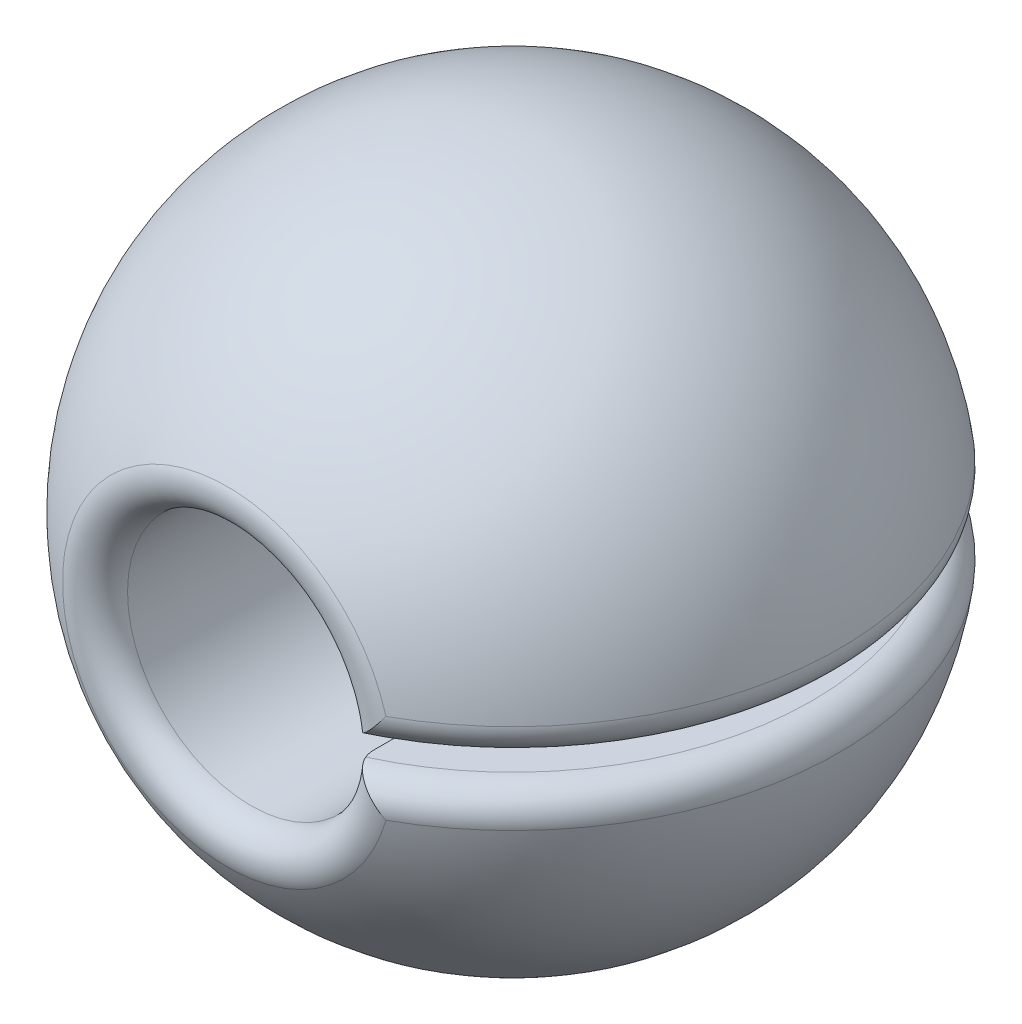
ISO-10303-21;
HEADER;
FILE_DESCRIPTION(('STEP AP214'),'2;1');
FILE_NAME('part.step','',(''),(''),'','','');
FILE_SCHEMA(('AUTOMOTIVE_DESIGN { 1 0 10303 214 1 1 1 1 }'));
ENDSEC;
DATA;
#1=APPLICATION_CONTEXT('core data for automotive mechanical design processes');
#2=APPLICATION_PROTOCOL_DEFINITION('international standard','automotive_design',2000,#1);
#3=PRODUCT_CONTEXT('',#1,'mechanical');
#4=PRODUCT('Part','Part','',(#3));
#5=PRODUCT_RELATED_PRODUCT_CATEGORY('part','',(#4));
#6=PRODUCT_DEFINITION_FORMATION('','',#4);
#7=PRODUCT_DEFINITION_CONTEXT('part definition',#1,'design');
#8=PRODUCT_DEFINITION('design','',#6,#7);
#9=PRODUCT_DEFINITION_SHAPE('','',#8);
#10=(LENGTH_UNIT() NAMED_UNIT(*) SI_UNIT(.MILLI.,.METRE.));
#11=(NAMED_UNIT(*) PLANE_ANGLE_UNIT() SI_UNIT($,.RADIAN.));
#12=(NAMED_UNIT(*) SI_UNIT($,.STERADIAN.) SOLID_ANGLE_UNIT());
#13=UNCERTAINTY_MEASURE_WITH_UNIT(LENGTH_MEASURE(1.E-05),#10,'distance_accuracy_value','');
#14=(GEOMETRIC_REPRESENTATION_CONTEXT(3) GLOBAL_UNCERTAINTY_ASSIGNED_CONTEXT((#13)) GLOBAL_UNIT_ASSIGNED_CONTEXT((#10,
#11,#12)) REPRESENTATION_CONTEXT('',''));
#15=CARTESIAN_POINT('',(0.,0.,0.));
#16=DIRECTION('',(0.,0.,1.));
#17=DIRECTION('',(1.,0.,0.));
#18=AXIS2_PLACEMENT_3D('',#15,#16,#17);
#19=CARTESIAN_POINT('',(0.,0.,0.));
#20=DIRECTION('',(0.,1.,0.));
#21=DIRECTION('',(1.,0.,0.));
#22=AXIS2_PLACEMENT_3D('',#19,#20,#21);
#23=SPHERICAL_SURFACE('',#22,12.);
#24=CARTESIAN_POINT('',(0.,1.63636363636364,0.));
#25=DIRECTION('',(0.,-1.,0.));
#26=DIRECTION('',(0.,0.,-1.));
#27=AXIS2_PLACEMENT_3D('',#24,#25,#26);
#28=CIRCLE('',#27,11.8879062096564);
#29=CARTESIAN_POINT('',(5.77254831505002,1.63636363636364,10.3923048454133));
#30=VERTEX_POINT('',#29);
#31=CARTESIAN_POINT('',(5.77254831505002,1.63636363636364,-10.3923048454133));
#32=VERTEX_POINT('',#31);
#33=EDGE_CURVE('E167',#30,#32,#28,.F.);
#34=ORIENTED_EDGE('',*,*,#33,.T.);
#35=CARTESIAN_POINT('',(0.,0.,-10.3923048454133));
#36=DIRECTION('',(0.,0.,1.));
#37=DIRECTION('',(1.,0.,0.));
#38=AXIS2_PLACEMENT_3D('',#35,#36,#37);
#39=CIRCLE('',#38,6.);
#40=CARTESIAN_POINT('',(5.77254831505002,-1.63636363636364,-10.3923048454133));
#41=VERTEX_POINT('',#40);
#42=EDGE_CURVE('E180',#32,#41,#39,.T.);
#43=ORIENTED_EDGE('',*,*,#42,.T.);
#44=CARTESIAN_POINT('',(0.,-1.63636363636364,0.));
#45=DIRECTION('',(0.,1.,0.));
#46=DIRECTION('',(0.,0.,1.));
#47=AXIS2_PLACEMENT_3D('',#44,#45,#46);
#48=CIRCLE('',#47,11.8879062096564);
#49=CARTESIAN_POINT('',(5.77254831505002,-1.63636363636364,10.3923048454133));
#50=VERTEX_POINT('',#49);
#51=EDGE_CURVE('E115',#41,#50,#48,.F.);
#52=ORIENTED_EDGE('',*,*,#51,.T.);
#53=CARTESIAN_POINT('',(0.,0.,10.3923048454133));
#54=DIRECTION('',(0.,0.,-1.));
#55=DIRECTION('',(-1.,0.,0.));
#56=AXIS2_PLACEMENT_3D('',#53,#54,#55);
#57=CIRCLE('',#56,6.);
#58=EDGE_CURVE('E112',#50,#30,#57,.T.);
#59=ORIENTED_EDGE('',*,*,#58,.T.);
#60=EDGE_LOOP('',(#34,#43,#52,#59));
#61=FACE_BOUND('',#60,.T.);
#62=ADVANCED_FACE('F33',(#61),#23,.T.);
#63=CARTESIAN_POINT('',(0.,0.,-15.));
#64=DIRECTION('',(0.,0.,1.));
#65=DIRECTION('',(1.,0.,0.));
#66=AXIS2_PLACEMENT_3D('',#63,#64,#65);
#67=CYLINDRICAL_SURFACE('',#66,4.5);
#68=DIRECTION('',(0.,0.,1.));
#69=VECTOR('',#68,1.);
#70=CARTESIAN_POINT('',(4.47213595499958,-0.5,-15.));
#71=LINE('',#70,#69);
#72=CARTESIAN_POINT('',(4.47213595499958,-0.5,9.52627944162882));
#73=VERTEX_POINT('',#72);
#74=CARTESIAN_POINT('',(4.47213595499958,-0.5,-9.52627944162882));
#75=VERTEX_POINT('',#74);
#76=EDGE_CURVE('E95',#73,#75,#71,.F.);
#77=ORIENTED_EDGE('',*,*,#76,.T.);
#78=CARTESIAN_POINT('',(0.,0.,-9.52627944162882));
#79=DIRECTION('',(0.,0.,1.));
#80=DIRECTION('',(1.,0.,0.));
#81=AXIS2_PLACEMENT_3D('',#78,#79,#80);
#82=CIRCLE('',#81,4.5);
#83=CARTESIAN_POINT('',(4.47213595499958,0.5,-9.52627944162882));
#84=VERTEX_POINT('',#83);
#85=EDGE_CURVE('E11',#75,#84,#82,.F.);
#86=ORIENTED_EDGE('',*,*,#85,.T.);
#87=DIRECTION('',(0.,0.,1.));
#88=VECTOR('',#87,1.);
#89=CARTESIAN_POINT('',(4.47213595499958,0.5,-15.));
#90=LINE('',#89,#88);
#91=CARTESIAN_POINT('',(4.47213595499958,0.5,9.52627944162882));
#92=VERTEX_POINT('',#91);
#93=EDGE_CURVE('E93',#84,#92,#90,.T.);
#94=ORIENTED_EDGE('',*,*,#93,.T.);
#95=CARTESIAN_POINT('',(0.,0.,9.52627944162882));
#96=DIRECTION('',(0.,0.,-1.));
#97=DIRECTION('',(-1.,0.,0.));
#98=AXIS2_PLACEMENT_3D('',#95,#96,#97);
#99=CIRCLE('',#98,4.5);
#100=EDGE_CURVE('E46',#92,#73,#99,.F.);
#101=ORIENTED_EDGE('',*,*,#100,.T.);
#102=EDGE_LOOP('',(#77,#86,#94,#101));
#103=FACE_BOUND('',#102,.T.);
#104=ADVANCED_FACE('F92',(#103),#67,.F.);
#105=CARTESIAN_POINT('',(2.09178170622718,-0.5,-23.));
#106=DIRECTION('',(0.,-1.,0.));
#107=DIRECTION('',(0.,0.,-1.));
#108=AXIS2_PLACEMENT_3D('',#105,#106,#107);
#109=PLANE('',#108);
#110=CARTESIAN_POINT('',(0.,-0.5,0.));
#111=DIRECTION('',(0.,-1.,0.));
#112=DIRECTION('',(0.,0.,-1.));
#113=AXIS2_PLACEMENT_3D('',#110,#111,#112);
#114=CIRCLE('',#113,10.8972473588517);
#115=CARTESIAN_POINT('',(4.54647123287216,-0.5,9.90351449378784));
#116=VERTEX_POINT('',#115);
#117=CARTESIAN_POINT('',(4.54647123287216,-0.5,-9.90351449378784));
#118=VERTEX_POINT('',#117);
#119=EDGE_CURVE('E54',#116,#118,#114,.F.);
#120=ORIENTED_EDGE('',*,*,#119,.T.);
#121=CARTESIAN_POINT('',(4.54647123287216,-0.5,-9.90351449378784));
#122=CARTESIAN_POINT('',(4.53418260254171,-0.5,-9.87354002631498));
#123=CARTESIAN_POINT('',(4.52336481780516,-0.5,-9.84296347047989));
#124=CARTESIAN_POINT('',(4.50484284419964,-0.5,-9.78119347319232));
#125=CARTESIAN_POINT('',(4.49711046006207,-0.5,-9.75000848448818));
#126=CARTESIAN_POINT('',(4.4846982400966,-0.5,-9.68703656280089));
#127=CARTESIAN_POINT('',(4.48001841562288,-0.5,-9.65524962757922));
#128=CARTESIAN_POINT('',(4.4737200035827,-0.5,-9.59107056785591));
#129=CARTESIAN_POINT('',(4.47213075748174,-0.5,-9.55867556297565));
#130=CARTESIAN_POINT('',(4.47213595499958,-0.5,-9.52627944162882));
#131=B_SPLINE_CURVE_WITH_KNOTS('',3,(#121,#122,#123,#124,#125,#126,#127,#128,#129,#130),
.UNSPECIFIED.,.F.,.F.,(4,2,2,2,4),(0.,0.0971472766579312,0.193385263046516,0.289623607396061,
0.3867712469464),.UNSPECIFIED.);
#132=EDGE_CURVE('E169',#118,#75,#131,.T.);
#133=ORIENTED_EDGE('',*,*,#132,.T.);
#134=ORIENTED_EDGE('',*,*,#76,.F.);
#135=CARTESIAN_POINT('',(4.47213595499958,-0.5,9.52627944162882));
#136=CARTESIAN_POINT('',(4.47213075748174,-0.5,9.55867556297565));
#137=CARTESIAN_POINT('',(4.4737200035827,-0.5,9.59107056785591));
#138=CARTESIAN_POINT('',(4.48001841562288,-0.5,9.65524962757922));
#139=CARTESIAN_POINT('',(4.4846982400966,-0.5,9.68703656280089));
#140=CARTESIAN_POINT('',(4.49711046006207,-0.5,9.75000848448818));
#141=CARTESIAN_POINT('',(4.50484284419964,-0.5,9.78119347319232));
#142=CARTESIAN_POINT('',(4.52336481780516,-0.5,9.84296347047989));
#143=CARTESIAN_POINT('',(4.53418260254171,-0.5,9.87354002631498));
#144=CARTESIAN_POINT('',(4.54647123287216,-0.5,9.90351449378784));
#145=B_SPLINE_CURVE_WITH_KNOTS('',3,(#135,#136,#137,#138,#139,#140,#141,#142,#143,#144),
.UNSPECIFIED.,.F.,.F.,(4,2,2,2,4),(0.,0.097147639550339,0.193385983899884,0.289623970288469,
0.386771246946401),.UNSPECIFIED.);
#146=EDGE_CURVE('E59',#73,#116,#145,.T.);
#147=ORIENTED_EDGE('',*,*,#146,.T.);
#148=EDGE_LOOP('',(#120,#133,#134,#147));
#149=FACE_BOUND('',#148,.T.);
#150=ADVANCED_FACE('F129',(#149),#109,.F.);
#151=CARTESIAN_POINT('',(2.09178170622718,0.5,-23.));
#152=DIRECTION('',(0.,1.,0.));
#153=DIRECTION('',(0.,0.,1.));
#154=AXIS2_PLACEMENT_3D('',#151,#152,#153);
#155=PLANE('',#154);
#156=ORIENTED_EDGE('',*,*,#93,.F.);
#157=CARTESIAN_POINT('',(4.47213595499958,0.5,-9.52627944162882));
#158=CARTESIAN_POINT('',(4.47213075748174,0.5,-9.55867556297565));
#159=CARTESIAN_POINT('',(4.4737200035827,0.5,-9.59107056785591));
#160=CARTESIAN_POINT('',(4.48001841562288,0.5,-9.65524962757922));
#161=CARTESIAN_POINT('',(4.4846982400966,0.5,-9.68703656280089));
#162=CARTESIAN_POINT('',(4.49711046006207,0.5,-9.75000848448818));
#163=CARTESIAN_POINT('',(4.50484284419964,0.5,-9.78119347319232));
#164=CARTESIAN_POINT('',(4.52336481780516,0.5,-9.84296347047989));
#165=CARTESIAN_POINT('',(4.53418260254171,0.5,-9.87354002631498));
#166=CARTESIAN_POINT('',(4.54647123287216,0.5,-9.90351449378784));
#167=B_SPLINE_CURVE_WITH_KNOTS('',3,(#157,#158,#159,#160,#161,#162,#163,#164,#165,#166),
.UNSPECIFIED.,.F.,.F.,(4,2,2,2,4),(0.,0.097147639550339,0.193385983899884,0.289623970288469,
0.386771246946401),.UNSPECIFIED.);
#168=CARTESIAN_POINT('',(4.54647123287216,0.5,-9.90351449378784));
#169=VERTEX_POINT('',#168);
#170=EDGE_CURVE('E102',#84,#169,#167,.T.);
#171=ORIENTED_EDGE('',*,*,#170,.T.);
#172=CARTESIAN_POINT('',(0.,0.5,0.));
#173=DIRECTION('',(0.,1.,0.));
#174=DIRECTION('',(0.,0.,1.));
#175=AXIS2_PLACEMENT_3D('',#172,#173,#174);
#176=CIRCLE('',#175,10.8972473588517);
#177=CARTESIAN_POINT('',(4.54647123287216,0.5,9.90351449378784));
#178=VERTEX_POINT('',#177);
#179=EDGE_CURVE('E113',#169,#178,#176,.F.);
#180=ORIENTED_EDGE('',*,*,#179,.T.);
#181=CARTESIAN_POINT('',(4.54647123287216,0.5,9.90351449378784));
#182=CARTESIAN_POINT('',(4.53418260254171,0.5,9.87354002631498));
#183=CARTESIAN_POINT('',(4.52336481780516,0.5,9.84296347047989));
#184=CARTESIAN_POINT('',(4.50484284419964,0.5,9.78119347319232));
#185=CARTESIAN_POINT('',(4.49711046006207,0.5,9.75000848448818));
#186=CARTESIAN_POINT('',(4.4846982400966,0.5,9.68703656280089));
#187=CARTESIAN_POINT('',(4.48001841562288,0.5,9.65524962757922));
#188=CARTESIAN_POINT('',(4.4737200035827,0.5,9.59107056785591));
#189=CARTESIAN_POINT('',(4.47213075748174,0.5,9.55867556297565));
#190=CARTESIAN_POINT('',(4.47213595499958,0.5,9.52627944162882));
#191=B_SPLINE_CURVE_WITH_KNOTS('',3,(#181,#182,#183,#184,#185,#186,#187,#188,#189,#190),
.UNSPECIFIED.,.F.,.F.,(4,2,2,2,4),(0.,0.0971472766579312,0.193385263046516,0.289623607396061,
0.3867712469464),.UNSPECIFIED.);
#192=EDGE_CURVE('E105',#178,#92,#191,.T.);
#193=ORIENTED_EDGE('',*,*,#192,.T.);
#194=EDGE_LOOP('',(#156,#171,#180,#193));
#195=FACE_BOUND('',#194,.T.);
#196=ADVANCED_FACE('F100',(#195),#155,.F.);
#197=CARTESIAN_POINT('',(0.,-1.5,0.));
#198=DIRECTION('',(0.,-1.,0.));
#199=DIRECTION('',(0.,0.,-1.));
#200=AXIS2_PLACEMENT_3D('',#197,#198,#199);
#201=TOROIDAL_SURFACE('',#200,10.8972473588517,1.);
#202=CARTESIAN_POINT('',(4.54647123287216,-0.5,9.90351449378784));
#203=CARTESIAN_POINT('',(4.55504478795309,-0.499997467446098,9.92444389320039));
#204=CARTESIAN_POINT('',(4.56425970133289,-0.500766703292494,9.94509764591151));
#205=CARTESIAN_POINT('',(4.58388777081532,-0.503829493641103,9.98569808757137));
#206=CARTESIAN_POINT('',(4.59430030701559,-0.506122262456393,10.0056451353863));
#207=CARTESIAN_POINT('',(4.62705012297283,-0.515210557221602,10.0639188777811));
#208=CARTESIAN_POINT('',(4.65103650924962,-0.524216805658822,10.1010103750184));
#209=CARTESIAN_POINT('',(4.70235590478707,-0.547582700935793,10.1707731068611));
#210=CARTESIAN_POINT('',(4.72968340906523,-0.561933619406731,10.2034514306934));
#211=CARTESIAN_POINT('',(4.78674874852517,-0.595256056838199,10.2640647897045));
#212=CARTESIAN_POINT('',(4.81649082441293,-0.614235827908506,10.2919912007398));
#213=CARTESIAN_POINT('',(4.88677571637847,-0.662427826432838,10.350702043664));
#214=CARTESIAN_POINT('',(4.92784027069523,-0.692994301657902,10.379749269137));
#215=CARTESIAN_POINT('',(5.01089260628309,-0.759125016427168,10.4296681242326));
#216=CARTESIAN_POINT('',(5.05288168230564,-0.794696697987896,10.4505274012823));
#217=CARTESIAN_POINT('',(5.14731706306613,-0.879164299374539,10.4888535004475));
#218=CARTESIAN_POINT('',(5.19969629423193,-0.929143386979618,10.5040946145814));
#219=CARTESIAN_POINT('',(5.30245639389798,-1.03312281143134,10.52332634545));
#220=CARTESIAN_POINT('',(5.35283544500066,-1.08712668264764,10.5273069513763));
#221=CARTESIAN_POINT('',(5.45102139549831,-1.19835386322152,10.524790825817));
#222=CARTESIAN_POINT('',(5.4987886901268,-1.25560877216113,10.5181636634775));
#223=CARTESIAN_POINT('',(5.59002177391666,-1.37132219078739,10.4948553619761));
#224=CARTESIAN_POINT('',(5.63349368681843,-1.42977883915475,10.4781887835305));
#225=CARTESIAN_POINT('',(5.70781661555575,-1.53599472539194,10.4392724091315));
#226=CARTESIAN_POINT('',(5.73951797786404,-1.58374281508189,10.4186145825585));
#227=CARTESIAN_POINT('',(5.77036791252422,-1.63287962428607,10.3940589442));
#228=CARTESIAN_POINT('',(5.77145943536433,-1.63462187901137,10.3931839375679));
#229=CARTESIAN_POINT('',(5.77254831505001,-1.63636363636364,10.3923048454133));
#230=B_SPLINE_CURVE_WITH_KNOTS('',3,(#202,#203,#204,#205,#206,#207,#208,#209,#210,#211,#212,
#213,#214,#215,#216,#217,#218,#219,#220,#221,#222,#223,#224,#225,#226,#227,#228,#229),
.UNSPECIFIED.,.F.,.F.,(4,2,2,2,2,2,2,2,2,2,2,2,2,4),(0.,0.0678050165835187,0.135575093185899,
0.270053385742416,0.404313018303941,0.538813775343015,0.714441921044576,0.890334015325144,
1.11113194243727,1.33212610155662,1.55585849474035,1.7792671752253,1.96156115224722,
1.96826430650546),.UNSPECIFIED.);
#231=EDGE_CURVE('E155',#50,#116,#230,.F.);
#232=ORIENTED_EDGE('',*,*,#231,.F.);
#233=ORIENTED_EDGE('',*,*,#51,.F.);
#234=CARTESIAN_POINT('',(4.54647123287216,-0.5,-9.90351449378784));
#235=CARTESIAN_POINT('',(4.55504478795309,-0.499997467446098,-9.92444389320039));
#236=CARTESIAN_POINT('',(4.56425970133289,-0.500766703292494,-9.94509764591151));
#237=CARTESIAN_POINT('',(4.58388777081532,-0.503829493641103,-9.98569808757137));
#238=CARTESIAN_POINT('',(4.59430030701559,-0.506122262456393,-10.0056451353863));
#239=CARTESIAN_POINT('',(4.62705012297283,-0.515210557221602,-10.0639188777811));
#240=CARTESIAN_POINT('',(4.65103650924962,-0.524216805658822,-10.1010103750184));
#241=CARTESIAN_POINT('',(4.70235590478707,-0.547582700935793,-10.1707731068611));
#242=CARTESIAN_POINT('',(4.72968340906523,-0.561933619406731,-10.2034514306934));
#243=CARTESIAN_POINT('',(4.78674874852517,-0.595256056838199,-10.2640647897045));
#244=CARTESIAN_POINT('',(4.81649082441293,-0.614235827908506,-10.2919912007398));
#245=CARTESIAN_POINT('',(4.88677571637847,-0.662427826432838,-10.350702043664));
#246=CARTESIAN_POINT('',(4.92784027069523,-0.692994301657902,-10.379749269137));
#247=CARTESIAN_POINT('',(5.01089260628309,-0.759125016427168,-10.4296681242326));
#248=CARTESIAN_POINT('',(5.05288168230564,-0.794696697987896,-10.4505274012823));
#249=CARTESIAN_POINT('',(5.14731706306613,-0.879164299374539,-10.4888535004475));
#250=CARTESIAN_POINT('',(5.19969629423193,-0.929143386979618,-10.5040946145814));
#251=CARTESIAN_POINT('',(5.30245639389798,-1.03312281143134,-10.52332634545));
#252=CARTESIAN_POINT('',(5.35283544500066,-1.08712668264764,-10.5273069513763));
#253=CARTESIAN_POINT('',(5.45102139549831,-1.19835386322152,-10.524790825817));
#254=CARTESIAN_POINT('',(5.4987886901268,-1.25560877216113,-10.5181636634775));
#255=CARTESIAN_POINT('',(5.59002177391666,-1.37132219078739,-10.4948553619761));
#256=CARTESIAN_POINT('',(5.63349368681843,-1.42977883915475,-10.4781887835305));
#257=CARTESIAN_POINT('',(5.70781661555575,-1.53599472539194,-10.4392724091315));
#258=CARTESIAN_POINT('',(5.73951797786404,-1.58374281508189,-10.4186145825585));
#259=CARTESIAN_POINT('',(5.77036791252422,-1.63287962428607,-10.3940589442));
#260=CARTESIAN_POINT('',(5.77145943536433,-1.63462187901137,-10.3931839375679));
#261=CARTESIAN_POINT('',(5.77254831505001,-1.63636363636364,-10.3923048454133));
#262=B_SPLINE_CURVE_WITH_KNOTS('',3,(#234,#235,#236,#237,#238,#239,#240,#241,#242,#243,#244,
#245,#246,#247,#248,#249,#250,#251,#252,#253,#254,#255,#256,#257,#258,#259,#260,#261),
.UNSPECIFIED.,.F.,.F.,(4,2,2,2,2,2,2,2,2,2,2,2,2,4),(0.,0.0678050165835187,0.135575093185899,
0.270053385742416,0.404313018303941,0.538813775343015,0.714441921044576,0.890334015325144,
1.11113194243727,1.33212610155662,1.55585849474035,1.7792671752253,1.96156115224722,
1.96826430650546),.UNSPECIFIED.);
#263=EDGE_CURVE('E38',#118,#41,#262,.T.);
#264=ORIENTED_EDGE('',*,*,#263,.F.);
#265=ORIENTED_EDGE('',*,*,#119,.F.);
#266=EDGE_LOOP('',(#232,#233,#264,#265));
#267=FACE_BOUND('',#266,.T.);
#268=ADVANCED_FACE('F35',(#267),#201,.T.);
#269=CARTESIAN_POINT('',(0.,0.,-9.52627944162882));
#270=DIRECTION('',(0.,0.,1.));
#271=DIRECTION('',(1.,0.,0.));
#272=AXIS2_PLACEMENT_3D('',#269,#270,#271);
#273=TOROIDAL_SURFACE('',#272,5.5,1.);
#274=ORIENTED_EDGE('',*,*,#263,.T.);
#275=ORIENTED_EDGE('',*,*,#42,.F.);
#276=CARTESIAN_POINT('',(4.54647123287216,0.5,-9.90351449378784));
#277=CARTESIAN_POINT('',(4.55504478795309,0.499997467446098,-9.92444389320039));
#278=CARTESIAN_POINT('',(4.56425970133289,0.500766703292494,-9.94509764591151));
#279=CARTESIAN_POINT('',(4.58388777081532,0.503829493641103,-9.98569808757137));
#280=CARTESIAN_POINT('',(4.59430030701559,0.506122262456392,-10.0056451353863));
#281=CARTESIAN_POINT('',(4.62705012297283,0.515210557221602,-10.0639188777811));
#282=CARTESIAN_POINT('',(4.65103650924962,0.524216805658821,-10.1010103750184));
#283=CARTESIAN_POINT('',(4.70235590478707,0.547582700935792,-10.1707731068611));
#284=CARTESIAN_POINT('',(4.72968340906523,0.56193361940673,-10.2034514306934));
#285=CARTESIAN_POINT('',(4.78674874852517,0.595256056838197,-10.2640647897045));
#286=CARTESIAN_POINT('',(4.81649082441293,0.614235827908504,-10.2919912007398));
#287=CARTESIAN_POINT('',(4.88677571637847,0.662427826432836,-10.350702043664));
#288=CARTESIAN_POINT('',(4.92784027069523,0.692994301657899,-10.379749269137));
#289=CARTESIAN_POINT('',(5.01089260628309,0.759125016427166,-10.4296681242326));
#290=CARTESIAN_POINT('',(5.05288168230564,0.794696697987894,-10.4505274012823));
#291=CARTESIAN_POINT('',(5.14731706306613,0.879164299374537,-10.4888535004475));
#292=CARTESIAN_POINT('',(5.19969629423192,0.929143386979616,-10.5040946145814));
#293=CARTESIAN_POINT('',(5.30245639389798,1.03312281143133,-10.52332634545));
#294=CARTESIAN_POINT('',(5.35283544500067,1.08712668264762,-10.5273069513763));
#295=CARTESIAN_POINT('',(5.45102139549829,1.19835386322154,-10.524790825817));
#296=CARTESIAN_POINT('',(5.49878869012673,1.25560877216119,-10.5181636634776));
#297=CARTESIAN_POINT('',(5.59002177391673,1.37132219078733,-10.494855361976));
#298=CARTESIAN_POINT('',(5.63349368681871,1.42977883915451,-10.4781887835304));
#299=CARTESIAN_POINT('',(5.70781661555552,1.53599472539213,-10.4392724091315));
#300=CARTESIAN_POINT('',(5.73951797786326,1.58374281508253,-10.4186145825588));
#301=CARTESIAN_POINT('',(5.77036791252417,1.63287962428612,-10.3940589442));
#302=CARTESIAN_POINT('',(5.7714594353643,1.6346218790114,-10.3931839375679));
#303=CARTESIAN_POINT('',(5.77254831505001,1.63636363636364,-10.3923048454133));
#304=B_SPLINE_CURVE_WITH_KNOTS('',3,(#276,#277,#278,#279,#280,#281,#282,#283,#284,#285,#286,
#287,#288,#289,#290,#291,#292,#293,#294,#295,#296,#297,#298,#299,#300,#301,#302,#303),
.UNSPECIFIED.,.F.,.F.,(4,2,2,2,2,2,2,2,2,2,2,2,2,4),(0.,0.0678050165835179,0.135575093185899,
0.270053385742415,0.40431301830394,0.538813775343014,0.714441921044576,0.890334015325141,
1.11113194243726,1.33212610155662,1.55585849474036,1.77926717522529,1.96156115224722,
1.96826430650547),.UNSPECIFIED.);
#305=EDGE_CURVE('E110',#169,#32,#304,.T.);
#306=ORIENTED_EDGE('',*,*,#305,.F.);
#307=ORIENTED_EDGE('',*,*,#170,.F.);
#308=ORIENTED_EDGE('',*,*,#85,.F.);
#309=ORIENTED_EDGE('',*,*,#132,.F.);
#310=EDGE_LOOP('',(#274,#275,#306,#307,#308,#309));
#311=FACE_BOUND('',#310,.T.);
#312=ADVANCED_FACE('F108',(#311),#273,.T.);
#313=CARTESIAN_POINT('',(0.,0.,9.52627944162882));
#314=DIRECTION('',(0.,0.,-1.));
#315=DIRECTION('',(-1.,0.,0.));
#316=AXIS2_PLACEMENT_3D('',#313,#314,#315);
#317=TOROIDAL_SURFACE('',#316,5.5,1.);
#318=ORIENTED_EDGE('',*,*,#100,.F.);
#319=ORIENTED_EDGE('',*,*,#192,.F.);
#320=CARTESIAN_POINT('',(4.54647123287216,0.5,9.90351449378784));
#321=CARTESIAN_POINT('',(4.55504478795309,0.499997467446098,9.92444389320039));
#322=CARTESIAN_POINT('',(4.56425970133289,0.500766703292494,9.94509764591151));
#323=CARTESIAN_POINT('',(4.58388777081532,0.503829493641103,9.98569808757137));
#324=CARTESIAN_POINT('',(4.59430030701559,0.506122262456393,10.0056451353863));
#325=CARTESIAN_POINT('',(4.62705012297283,0.515210557221602,10.0639188777811));
#326=CARTESIAN_POINT('',(4.65103650924962,0.524216805658822,10.1010103750184));
#327=CARTESIAN_POINT('',(4.70235590478707,0.547582700935793,10.1707731068611));
#328=CARTESIAN_POINT('',(4.72968340906523,0.561933619406731,10.2034514306934));
#329=CARTESIAN_POINT('',(4.78674874852517,0.595256056838199,10.2640647897045));
#330=CARTESIAN_POINT('',(4.81649082441293,0.614235827908506,10.2919912007398));
#331=CARTESIAN_POINT('',(4.88677571637847,0.662427826432838,10.350702043664));
#332=CARTESIAN_POINT('',(4.92784027069523,0.692994301657902,10.379749269137));
#333=CARTESIAN_POINT('',(5.01089260628309,0.759125016427168,10.4296681242326));
#334=CARTESIAN_POINT('',(5.05288168230564,0.794696697987896,10.4505274012823));
#335=CARTESIAN_POINT('',(5.14731706306613,0.879164299374539,10.4888535004475));
#336=CARTESIAN_POINT('',(5.19969629423193,0.929143386979618,10.5040946145814));
#337=CARTESIAN_POINT('',(5.30245639389798,1.03312281143134,10.52332634545));
#338=CARTESIAN_POINT('',(5.35283544500066,1.08712668264764,10.5273069513763));
#339=CARTESIAN_POINT('',(5.45102139549831,1.19835386322152,10.524790825817));
#340=CARTESIAN_POINT('',(5.4987886901268,1.25560877216113,10.5181636634775));
#341=CARTESIAN_POINT('',(5.59002177391666,1.37132219078739,10.4948553619761));
#342=CARTESIAN_POINT('',(5.63349368681843,1.42977883915475,10.4781887835305));
#343=CARTESIAN_POINT('',(5.70781661555575,1.53599472539194,10.4392724091315));
#344=CARTESIAN_POINT('',(5.73951797786404,1.58374281508189,10.4186145825585));
#345=CARTESIAN_POINT('',(5.77036791252422,1.63287962428607,10.3940589442));
#346=CARTESIAN_POINT('',(5.77145943536433,1.63462187901137,10.3931839375679));
#347=CARTESIAN_POINT('',(5.77254831505001,1.63636363636364,10.3923048454133));
#348=B_SPLINE_CURVE_WITH_KNOTS('',3,(#320,#321,#322,#323,#324,#325,#326,#327,#328,#329,#330,
#331,#332,#333,#334,#335,#336,#337,#338,#339,#340,#341,#342,#343,#344,#345,#346,#347),
.UNSPECIFIED.,.F.,.F.,(4,2,2,2,2,2,2,2,2,2,2,2,2,4),(0.,0.0678050165835187,0.135575093185899,
0.270053385742416,0.404313018303941,0.538813775343015,0.714441921044576,0.890334015325144,
1.11113194243727,1.33212610155662,1.55585849474035,1.7792671752253,1.96156115224722,
1.96826430650546),.UNSPECIFIED.);
#349=EDGE_CURVE('E148',#30,#178,#348,.F.);
#350=ORIENTED_EDGE('',*,*,#349,.F.);
#351=ORIENTED_EDGE('',*,*,#58,.F.);
#352=ORIENTED_EDGE('',*,*,#231,.T.);
#353=ORIENTED_EDGE('',*,*,#146,.F.);
#354=EDGE_LOOP('',(#318,#319,#350,#351,#352,#353));
#355=FACE_BOUND('',#354,.T.);
#356=ADVANCED_FACE('F138',(#355),#317,.T.);
#357=CARTESIAN_POINT('',(0.,1.5,0.));
#358=DIRECTION('',(0.,1.,0.));
#359=DIRECTION('',(0.,0.,1.));
#360=AXIS2_PLACEMENT_3D('',#357,#358,#359);
#361=TOROIDAL_SURFACE('',#360,10.8972473588517,1.);
#362=ORIENTED_EDGE('',*,*,#305,.T.);
#363=ORIENTED_EDGE('',*,*,#33,.F.);
#364=ORIENTED_EDGE('',*,*,#349,.T.);
#365=ORIENTED_EDGE('',*,*,#179,.F.);
#366=EDGE_LOOP('',(#362,#363,#364,#365));
#367=FACE_BOUND('',#366,.T.);
#368=ADVANCED_FACE('F142',(#367),#361,.T.);
#369=CLOSED_SHELL('',(#62,#104,#150,#196,#268,#312,#356,#368));
#370=MANIFOLD_SOLID_BREP('B2',#369);
#371=ADVANCED_BREP_SHAPE_REPRESENTATION('',(#18,#370),#14);
#372=SHAPE_DEFINITION_REPRESENTATION(#9,#371);
ENDSEC;
END-ISO-10303-21;
